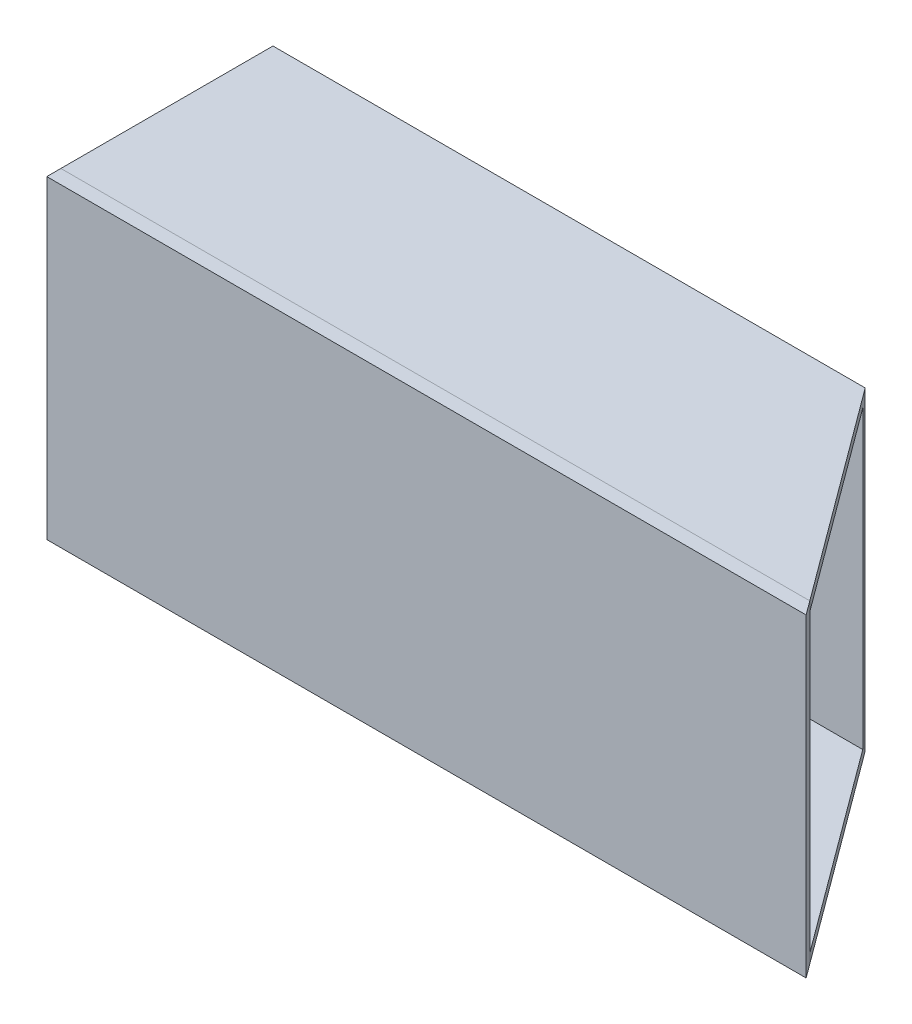
ISO-10303-21;
HEADER;
FILE_DESCRIPTION(('STEP AP214'),'2;1');
FILE_NAME('part.step','',(''),(''),'','','');
FILE_SCHEMA(('AUTOMOTIVE_DESIGN { 1 0 10303 214 1 1 1 1 }'));
ENDSEC;
DATA;
#1=APPLICATION_CONTEXT('core data for automotive mechanical design processes');
#2=APPLICATION_PROTOCOL_DEFINITION('international standard','automotive_design',2000,#1);
#3=PRODUCT_CONTEXT('',#1,'mechanical');
#4=PRODUCT('Part','Part','',(#3));
#5=PRODUCT_RELATED_PRODUCT_CATEGORY('part','',(#4));
#6=PRODUCT_DEFINITION_FORMATION('','',#4);
#7=PRODUCT_DEFINITION_CONTEXT('part definition',#1,'design');
#8=PRODUCT_DEFINITION('design','',#6,#7);
#9=PRODUCT_DEFINITION_SHAPE('','',#8);
#10=(LENGTH_UNIT() NAMED_UNIT(*) SI_UNIT(.MILLI.,.METRE.));
#11=(NAMED_UNIT(*) PLANE_ANGLE_UNIT() SI_UNIT($,.RADIAN.));
#12=(NAMED_UNIT(*) SI_UNIT($,.STERADIAN.) SOLID_ANGLE_UNIT());
#13=UNCERTAINTY_MEASURE_WITH_UNIT(LENGTH_MEASURE(1.E-05),#10,'distance_accuracy_value','');
#14=(GEOMETRIC_REPRESENTATION_CONTEXT(3) GLOBAL_UNCERTAINTY_ASSIGNED_CONTEXT((#13)) GLOBAL_UNIT_ASSIGNED_CONTEXT((#10,
#11,#12)) REPRESENTATION_CONTEXT('',''));
#15=CARTESIAN_POINT('',(0.,0.,0.));
#16=DIRECTION('',(0.,0.,1.));
#17=DIRECTION('',(1.,0.,0.));
#18=AXIS2_PLACEMENT_3D('',#15,#16,#17);
#19=CARTESIAN_POINT('',(0.,0.,0.));
#20=DIRECTION('',(0.,0.,-1.));
#21=DIRECTION('',(-1.,0.,0.));
#22=AXIS2_PLACEMENT_3D('',#19,#20,#21);
#23=PLANE('',#22);
#24=DIRECTION('',(0.,1.,0.));
#25=VECTOR('',#24,1.);
#26=CARTESIAN_POINT('',(89.335240673485,0.,0.));
#27=LINE('',#26,#25);
#28=CARTESIAN_POINT('',(89.3352406734849,-129.5,0.));
#29=VERTEX_POINT('',#28);
#30=CARTESIAN_POINT('',(89.3352406734849,-62.5,0.));
#31=VERTEX_POINT('',#30);
#32=EDGE_CURVE('E84',#29,#31,#27,.T.);
#33=ORIENTED_EDGE('',*,*,#32,.F.);
#34=DIRECTION('',(1.,0.,0.));
#35=VECTOR('',#34,1.);
#36=CARTESIAN_POINT('',(90.3908016052301,-129.5,0.));
#37=LINE('',#36,#35);
#38=CARTESIAN_POINT('',(-70.2750696839847,-129.5,0.));
#39=VERTEX_POINT('',#38);
#40=EDGE_CURVE('E87',#39,#29,#37,.T.);
#41=ORIENTED_EDGE('',*,*,#40,.F.);
#42=DIRECTION('',(0.,-1.,0.));
#43=VECTOR('',#42,1.);
#44=CARTESIAN_POINT('',(-70.2750696839847,-64.5,0.));
#45=LINE('',#44,#43);
#46=CARTESIAN_POINT('',(-70.2750696839846,-62.5,0.));
#47=VERTEX_POINT('',#46);
#48=EDGE_CURVE('E98',#47,#39,#45,.T.);
#49=ORIENTED_EDGE('',*,*,#48,.F.);
#50=DIRECTION('',(-1.,0.,0.));
#51=VECTOR('',#50,1.);
#52=CARTESIAN_POINT('',(90.3908016052301,-62.5,0.));
#53=LINE('',#52,#51);
#54=EDGE_CURVE('E89',#31,#47,#53,.T.);
#55=ORIENTED_EDGE('',*,*,#54,.F.);
#56=EDGE_LOOP('',(#33,#41,#49,#55));
#57=FACE_BOUND('',#56,.T.);
#58=ADVANCED_FACE('F42',(#57),#23,.T.);
#59=CARTESIAN_POINT('',(90.3908016052301,-129.5,-43.2));
#60=DIRECTION('',(0.,-1.,0.));
#61=DIRECTION('',(0.,0.,-1.));
#62=AXIS2_PLACEMENT_3D('',#59,#60,#61);
#63=PLANE('',#62);
#64=DIRECTION('',(0.,0.,1.));
#65=VECTOR('',#64,1.);
#66=CARTESIAN_POINT('',(-70.2750696839847,-129.5,-43.2));
#67=LINE('',#66,#65);
#68=CARTESIAN_POINT('',(-70.2750696839847,-129.5,3.));
#69=VERTEX_POINT('',#68);
#70=EDGE_CURVE('E91',#39,#69,#67,.T.);
#71=ORIENTED_EDGE('',*,*,#70,.F.);
#72=ORIENTED_EDGE('',*,*,#40,.T.);
#73=DIRECTION('',(-0.594194297617431,0.,-0.80432153811702));
#74=VECTOR('',#73,1.);
#75=CARTESIAN_POINT('',(69.0616389362199,-129.5,-27.443034370868));
#76=LINE('',#75,#74);
#77=CARTESIAN_POINT('',(91.5514972429975,-129.5,3.));
#78=VERTEX_POINT('',#77);
#79=EDGE_CURVE('E96',#78,#29,#76,.T.);
#80=ORIENTED_EDGE('',*,*,#79,.F.);
#81=DIRECTION('',(1.,0.,0.));
#82=VECTOR('',#81,1.);
#83=CARTESIAN_POINT('',(90.3908016052301,-129.5,3.));
#84=LINE('',#83,#82);
#85=EDGE_CURVE('E106',#69,#78,#84,.T.);
#86=ORIENTED_EDGE('',*,*,#85,.F.);
#87=EDGE_LOOP('',(#71,#72,#80,#86));
#88=FACE_BOUND('',#87,.T.);
#89=ADVANCED_FACE('F94',(#88),#63,.T.);
#90=CARTESIAN_POINT('',(0.,0.,3.));
#91=DIRECTION('',(0.,0.,-1.));
#92=DIRECTION('',(-1.,0.,0.));
#93=AXIS2_PLACEMENT_3D('',#90,#91,#92);
#94=PLANE('',#93);
#95=ORIENTED_EDGE('',*,*,#85,.T.);
#96=DIRECTION('',(0.,1.,0.));
#97=VECTOR('',#96,1.);
#98=CARTESIAN_POINT('',(91.5514972429975,-360.73705276397,3.));
#99=LINE('',#98,#97);
#100=CARTESIAN_POINT('',(91.5514972429975,-62.5,3.));
#101=VERTEX_POINT('',#100);
#102=EDGE_CURVE('E12',#78,#101,#99,.T.);
#103=ORIENTED_EDGE('',*,*,#102,.T.);
#104=DIRECTION('',(-1.,0.,0.));
#105=VECTOR('',#104,1.);
#106=CARTESIAN_POINT('',(90.3908016052301,-62.5,3.));
#107=LINE('',#106,#105);
#108=CARTESIAN_POINT('',(-70.2750696839847,-62.5,3.));
#109=VERTEX_POINT('',#108);
#110=EDGE_CURVE('E101',#101,#109,#107,.T.);
#111=ORIENTED_EDGE('',*,*,#110,.T.);
#112=DIRECTION('',(0.,-1.,0.));
#113=VECTOR('',#112,1.);
#114=CARTESIAN_POINT('',(-70.2750696839847,-64.5,3.));
#115=LINE('',#114,#113);
#116=EDGE_CURVE('E102',#109,#69,#115,.T.);
#117=ORIENTED_EDGE('',*,*,#116,.T.);
#118=EDGE_LOOP('',(#95,#103,#111,#117));
#119=FACE_BOUND('',#118,.T.);
#120=ADVANCED_FACE('F114',(#119),#94,.F.);
#121=CARTESIAN_POINT('',(-70.2750696839847,-64.5,-43.2));
#122=DIRECTION('',(-1.,0.,0.));
#123=DIRECTION('',(0.,0.,1.));
#124=AXIS2_PLACEMENT_3D('',#121,#122,#123);
#125=PLANE('',#124);
#126=DIRECTION('',(0.,0.,1.));
#127=VECTOR('',#126,1.);
#128=CARTESIAN_POINT('',(-70.2750696839846,-62.5,-43.2));
#129=LINE('',#128,#127);
#130=EDGE_CURVE('E65',#47,#109,#129,.T.);
#131=ORIENTED_EDGE('',*,*,#130,.F.);
#132=ORIENTED_EDGE('',*,*,#48,.T.);
#133=ORIENTED_EDGE('',*,*,#70,.T.);
#134=ORIENTED_EDGE('',*,*,#116,.F.);
#135=EDGE_LOOP('',(#131,#132,#133,#134));
#136=FACE_BOUND('',#135,.T.);
#137=ADVANCED_FACE('F116',(#136),#125,.T.);
#138=CARTESIAN_POINT('',(55.943641692829,-360.73705276397,-45.2));
#139=DIRECTION('',(-0.804321538117019,0.,0.594194297617431));
#140=DIRECTION('',(0.594194297617431,0.,0.80432153811702));
#141=AXIS2_PLACEMENT_3D('',#138,#139,#140);
#142=PLANE('',#141);
#143=ORIENTED_EDGE('',*,*,#32,.T.);
#144=DIRECTION('',(0.594194297617431,0.,0.80432153811702));
#145=VECTOR('',#144,1.);
#146=CARTESIAN_POINT('',(69.0616389362199,-62.5,-27.443034370868));
#147=LINE('',#146,#145);
#148=EDGE_CURVE('E46',#31,#101,#147,.T.);
#149=ORIENTED_EDGE('',*,*,#148,.T.);
#150=ORIENTED_EDGE('',*,*,#102,.F.);
#151=ORIENTED_EDGE('',*,*,#79,.T.);
#152=EDGE_LOOP('',(#143,#149,#150,#151));
#153=FACE_BOUND('',#152,.T.);
#154=ADVANCED_FACE('F100',(#153),#142,.F.);
#155=CARTESIAN_POINT('',(90.3908016052301,-62.5,-43.2));
#156=DIRECTION('',(0.,1.,0.));
#157=DIRECTION('',(0.,0.,1.));
#158=AXIS2_PLACEMENT_3D('',#155,#156,#157);
#159=PLANE('',#158);
#160=ORIENTED_EDGE('',*,*,#148,.F.);
#161=ORIENTED_EDGE('',*,*,#54,.T.);
#162=ORIENTED_EDGE('',*,*,#130,.T.);
#163=ORIENTED_EDGE('',*,*,#110,.F.);
#164=EDGE_LOOP('',(#160,#161,#162,#163));
#165=FACE_BOUND('',#164,.T.);
#166=ADVANCED_FACE('F44',(#165),#159,.T.);
#167=CLOSED_SHELL('',(#58,#89,#120,#137,#154,#166));
#168=MANIFOLD_SOLID_BREP('B2',#167);
#169=CARTESIAN_POINT('',(0.,0.,0.));
#170=DIRECTION('',(0.,0.,-1.));
#171=DIRECTION('',(-1.,0.,0.));
#172=AXIS2_PLACEMENT_3D('',#169,#170,#171);
#173=PLANE('',#172);
#174=DIRECTION('',(0.,-1.,0.));
#175=VECTOR('',#174,1.);
#176=CARTESIAN_POINT('',(89.3352406734849,-360.73705276397,0.));
#177=LINE('',#176,#175);
#178=CARTESIAN_POINT('',(89.3352406734849,-62.5,0.));
#179=VERTEX_POINT('',#178);
#180=CARTESIAN_POINT('',(89.335240673485,-64.5,0.));
#181=VERTEX_POINT('',#180);
#182=EDGE_CURVE('E171',#179,#181,#177,.T.);
#183=ORIENTED_EDGE('',*,*,#182,.F.);
#184=DIRECTION('',(-1.,0.,0.));
#185=VECTOR('',#184,1.);
#186=CARTESIAN_POINT('',(90.3908016052301,-62.5,0.));
#187=LINE('',#186,#185);
#188=CARTESIAN_POINT('',(-70.2750696839846,-62.5,0.));
#189=VERTEX_POINT('',#188);
#190=EDGE_CURVE('E40',#179,#189,#187,.T.);
#191=ORIENTED_EDGE('',*,*,#190,.T.);
#192=DIRECTION('',(0.,-1.,0.));
#193=VECTOR('',#192,1.);
#194=CARTESIAN_POINT('',(-70.2750696839847,-64.5,0.));
#195=LINE('',#194,#193);
#196=CARTESIAN_POINT('',(-70.2750696839847,-129.5,0.));
#197=VERTEX_POINT('',#196);
#198=EDGE_CURVE('E176',#189,#197,#195,.T.);
#199=ORIENTED_EDGE('',*,*,#198,.T.);
#200=DIRECTION('',(1.,0.,0.));
#201=VECTOR('',#200,1.);
#202=CARTESIAN_POINT('',(90.3908016052301,-129.5,0.));
#203=LINE('',#202,#201);
#204=CARTESIAN_POINT('',(89.3352406734849,-129.5,0.));
#205=VERTEX_POINT('',#204);
#206=EDGE_CURVE('E294',#197,#205,#203,.T.);
#207=ORIENTED_EDGE('',*,*,#206,.T.);
#208=CARTESIAN_POINT('',(89.335240673485,-127.5,0.));
#209=VERTEX_POINT('',#208);
#210=EDGE_CURVE('E240',#209,#205,#177,.T.);
#211=ORIENTED_EDGE('',*,*,#210,.F.);
#212=DIRECTION('',(1.,0.,0.));
#213=VECTOR('',#212,1.);
#214=CARTESIAN_POINT('',(90.3908016052301,-127.5,0.));
#215=LINE('',#214,#213);
#216=CARTESIAN_POINT('',(-67.2750696839847,-127.5,0.));
#217=VERTEX_POINT('',#216);
#218=EDGE_CURVE('E278',#217,#209,#215,.T.);
#219=ORIENTED_EDGE('',*,*,#218,.F.);
#220=DIRECTION('',(0.,-1.,0.));
#221=VECTOR('',#220,1.);
#222=CARTESIAN_POINT('',(-67.2750696839847,-64.5,0.));
#223=LINE('',#222,#221);
#224=CARTESIAN_POINT('',(-67.2750696839847,-64.5,0.));
#225=VERTEX_POINT('',#224);
#226=EDGE_CURVE('E274',#225,#217,#223,.T.);
#227=ORIENTED_EDGE('',*,*,#226,.F.);
#228=DIRECTION('',(-1.,0.,0.));
#229=VECTOR('',#228,1.);
#230=CARTESIAN_POINT('',(90.3908016052301,-64.5,0.));
#231=LINE('',#230,#229);
#232=EDGE_CURVE('E276',#181,#225,#231,.T.);
#233=ORIENTED_EDGE('',*,*,#232,.F.);
#234=EDGE_LOOP('',(#183,#191,#199,#207,#211,#219,#227,#233));
#235=FACE_BOUND('',#234,.T.);
#236=ADVANCED_FACE('F168',(#235),#173,.F.);
#237=CARTESIAN_POINT('',(-67.2750696839847,-64.5,-43.2));
#238=DIRECTION('',(-1.,0.,0.));
#239=DIRECTION('',(0.,0.,1.));
#240=AXIS2_PLACEMENT_3D('',#237,#238,#239);
#241=PLANE('',#240);
#242=ORIENTED_EDGE('',*,*,#226,.T.);
#243=DIRECTION('',(0.,0.,1.));
#244=VECTOR('',#243,1.);
#245=CARTESIAN_POINT('',(-67.2750696839847,-127.5,-43.2));
#246=LINE('',#245,#244);
#247=CARTESIAN_POINT('',(-67.2750696839847,-127.5,-43.2));
#248=VERTEX_POINT('',#247);
#249=EDGE_CURVE('E285',#248,#217,#246,.T.);
#250=ORIENTED_EDGE('',*,*,#249,.F.);
#251=DIRECTION('',(0.,-1.,0.));
#252=VECTOR('',#251,1.);
#253=CARTESIAN_POINT('',(-67.2750696839847,-64.5,-43.2));
#254=LINE('',#253,#252);
#255=CARTESIAN_POINT('',(-67.2750696839847,-64.5,-43.2));
#256=VERTEX_POINT('',#255);
#257=EDGE_CURVE('E288',#256,#248,#254,.T.);
#258=ORIENTED_EDGE('',*,*,#257,.F.);
#259=DIRECTION('',(0.,0.,1.));
#260=VECTOR('',#259,1.);
#261=CARTESIAN_POINT('',(-67.2750696839847,-64.5,-43.2));
#262=LINE('',#261,#260);
#263=EDGE_CURVE('E280',#256,#225,#262,.T.);
#264=ORIENTED_EDGE('',*,*,#263,.T.);
#265=EDGE_LOOP('',(#242,#250,#258,#264));
#266=FACE_BOUND('',#265,.T.);
#267=ADVANCED_FACE('F310',(#266),#241,.F.);
#268=CARTESIAN_POINT('',(90.3908016052301,-127.5,-43.2));
#269=DIRECTION('',(0.,-1.,0.));
#270=DIRECTION('',(0.,0.,-1.));
#271=AXIS2_PLACEMENT_3D('',#268,#269,#270);
#272=PLANE('',#271);
#273=DIRECTION('',(-0.594194297617431,0.,-0.804321538117019));
#274=VECTOR('',#273,1.);
#275=CARTESIAN_POINT('',(51.2571512718471,-127.5,-51.5437922559832));
#276=LINE('',#275,#274);
#277=CARTESIAN_POINT('',(57.4211460725041,-127.5,-43.2));
#278=VERTEX_POINT('',#277);
#279=EDGE_CURVE('E265',#209,#278,#276,.T.);
#280=ORIENTED_EDGE('',*,*,#279,.T.);
#281=DIRECTION('',(1.,0.,0.));
#282=VECTOR('',#281,1.);
#283=CARTESIAN_POINT('',(90.3908016052301,-127.5,-43.2));
#284=LINE('',#283,#282);
#285=EDGE_CURVE('E291',#248,#278,#284,.T.);
#286=ORIENTED_EDGE('',*,*,#285,.F.);
#287=ORIENTED_EDGE('',*,*,#249,.T.);
#288=ORIENTED_EDGE('',*,*,#218,.T.);
#289=EDGE_LOOP('',(#280,#286,#287,#288));
#290=FACE_BOUND('',#289,.T.);
#291=ADVANCED_FACE('F307',(#290),#272,.F.);
#292=CARTESIAN_POINT('',(0.,0.,-43.2));
#293=DIRECTION('',(0.,0.,-1.));
#294=DIRECTION('',(-1.,0.,0.));
#295=AXIS2_PLACEMENT_3D('',#292,#293,#294);
#296=PLANE('',#295);
#297=DIRECTION('',(0.,1.,0.));
#298=VECTOR('',#297,1.);
#299=CARTESIAN_POINT('',(57.4211460725041,0.,-43.2));
#300=LINE('',#299,#298);
#301=CARTESIAN_POINT('',(57.4211460725041,-64.5,-43.2));
#302=VERTEX_POINT('',#301);
#303=EDGE_CURVE('E271',#278,#302,#300,.T.);
#304=ORIENTED_EDGE('',*,*,#303,.T.);
#305=DIRECTION('',(-1.,0.,0.));
#306=VECTOR('',#305,1.);
#307=CARTESIAN_POINT('',(90.3908016052301,-64.5,-43.2));
#308=LINE('',#307,#306);
#309=EDGE_CURVE('E283',#302,#256,#308,.T.);
#310=ORIENTED_EDGE('',*,*,#309,.T.);
#311=ORIENTED_EDGE('',*,*,#257,.T.);
#312=ORIENTED_EDGE('',*,*,#285,.T.);
#313=EDGE_LOOP('',(#304,#310,#311,#312));
#314=FACE_BOUND('',#313,.T.);
#315=ADVANCED_FACE('F304',(#314),#296,.F.);
#316=CARTESIAN_POINT('',(90.3908016052301,-64.5,-43.2));
#317=DIRECTION('',(0.,1.,0.));
#318=DIRECTION('',(0.,0.,1.));
#319=AXIS2_PLACEMENT_3D('',#316,#317,#318);
#320=PLANE('',#319);
#321=DIRECTION('',(0.594194297617431,0.,0.80432153811702));
#322=VECTOR('',#321,1.);
#323=CARTESIAN_POINT('',(69.0616389362199,-64.5,-27.443034370868));
#324=LINE('',#323,#322);
#325=EDGE_CURVE('E268',#302,#181,#324,.T.);
#326=ORIENTED_EDGE('',*,*,#325,.T.);
#327=ORIENTED_EDGE('',*,*,#232,.T.);
#328=ORIENTED_EDGE('',*,*,#263,.F.);
#329=ORIENTED_EDGE('',*,*,#309,.F.);
#330=EDGE_LOOP('',(#326,#327,#328,#329));
#331=FACE_BOUND('',#330,.T.);
#332=ADVANCED_FACE('F299',(#331),#320,.F.);
#333=CARTESIAN_POINT('',(90.3908016052301,-129.5,-43.2));
#334=DIRECTION('',(0.,-1.,0.));
#335=DIRECTION('',(0.,0.,-1.));
#336=AXIS2_PLACEMENT_3D('',#333,#334,#335);
#337=PLANE('',#336);
#338=ORIENTED_EDGE('',*,*,#206,.F.);
#339=DIRECTION('',(0.,0.,1.));
#340=VECTOR('',#339,1.);
#341=CARTESIAN_POINT('',(-70.2750696839847,-129.5,-43.2));
#342=LINE('',#341,#340);
#343=CARTESIAN_POINT('',(-70.2750696839847,-129.5,-45.2));
#344=VERTEX_POINT('',#343);
#345=EDGE_CURVE('E255',#344,#197,#342,.T.);
#346=ORIENTED_EDGE('',*,*,#345,.F.);
#347=DIRECTION('',(1.,0.,0.));
#348=VECTOR('',#347,1.);
#349=CARTESIAN_POINT('',(90.3908016052301,-129.5,-45.2));
#350=LINE('',#349,#348);
#351=CARTESIAN_POINT('',(55.943641692829,-129.5,-45.2));
#352=VERTEX_POINT('',#351);
#353=EDGE_CURVE('E252',#344,#352,#350,.T.);
#354=ORIENTED_EDGE('',*,*,#353,.T.);
#355=DIRECTION('',(-0.594194297617431,0.,-0.80432153811702));
#356=VECTOR('',#355,1.);
#357=CARTESIAN_POINT('',(69.0616389362199,-129.5,-27.443034370868));
#358=LINE('',#357,#356);
#359=EDGE_CURVE('E233',#205,#352,#358,.T.);
#360=ORIENTED_EDGE('',*,*,#359,.F.);
#361=EDGE_LOOP('',(#338,#346,#354,#360));
#362=FACE_BOUND('',#361,.T.);
#363=ADVANCED_FACE('F254',(#362),#337,.T.);
#364=CARTESIAN_POINT('',(-70.2750696839847,-64.5,-43.2));
#365=DIRECTION('',(-1.,0.,0.));
#366=DIRECTION('',(0.,0.,1.));
#367=AXIS2_PLACEMENT_3D('',#364,#365,#366);
#368=PLANE('',#367);
#369=ORIENTED_EDGE('',*,*,#198,.F.);
#370=DIRECTION('',(0.,0.,1.));
#371=VECTOR('',#370,1.);
#372=CARTESIAN_POINT('',(-70.2750696839846,-62.5,-43.2));
#373=LINE('',#372,#371);
#374=CARTESIAN_POINT('',(-70.2750696839847,-62.5,-45.2));
#375=VERTEX_POINT('',#374);
#376=EDGE_CURVE('E257',#375,#189,#373,.T.);
#377=ORIENTED_EDGE('',*,*,#376,.F.);
#378=DIRECTION('',(0.,-1.,0.));
#379=VECTOR('',#378,1.);
#380=CARTESIAN_POINT('',(-70.2750696839847,-64.5,-45.2));
#381=LINE('',#380,#379);
#382=EDGE_CURVE('E258',#375,#344,#381,.T.);
#383=ORIENTED_EDGE('',*,*,#382,.T.);
#384=ORIENTED_EDGE('',*,*,#345,.T.);
#385=EDGE_LOOP('',(#369,#377,#383,#384));
#386=FACE_BOUND('',#385,.T.);
#387=ADVANCED_FACE('F327',(#386),#368,.T.);
#388=CARTESIAN_POINT('',(0.,0.,-45.2));
#389=DIRECTION('',(0.,0.,-1.));
#390=DIRECTION('',(-1.,0.,0.));
#391=AXIS2_PLACEMENT_3D('',#388,#389,#390);
#392=PLANE('',#391);
#393=DIRECTION('',(0.,1.,0.));
#394=VECTOR('',#393,1.);
#395=CARTESIAN_POINT('',(55.943641692829,-360.73705276397,-45.2));
#396=LINE('',#395,#394);
#397=CARTESIAN_POINT('',(55.943641692829,-62.5,-45.2));
#398=VERTEX_POINT('',#397);
#399=EDGE_CURVE('E237',#352,#398,#396,.T.);
#400=ORIENTED_EDGE('',*,*,#399,.F.);
#401=ORIENTED_EDGE('',*,*,#353,.F.);
#402=ORIENTED_EDGE('',*,*,#382,.F.);
#403=DIRECTION('',(-1.,0.,0.));
#404=VECTOR('',#403,1.);
#405=CARTESIAN_POINT('',(90.3908016052301,-62.5,-45.2));
#406=LINE('',#405,#404);
#407=EDGE_CURVE('E244',#398,#375,#406,.T.);
#408=ORIENTED_EDGE('',*,*,#407,.F.);
#409=EDGE_LOOP('',(#400,#401,#402,#408));
#410=FACE_BOUND('',#409,.T.);
#411=ADVANCED_FACE('F250',(#410),#392,.T.);
#412=CARTESIAN_POINT('',(55.943641692829,-360.73705276397,-45.2));
#413=DIRECTION('',(-0.804321538117019,0.,0.594194297617431));
#414=DIRECTION('',(0.594194297617431,0.,0.80432153811702));
#415=AXIS2_PLACEMENT_3D('',#412,#413,#414);
#416=PLANE('',#415);
#417=DIRECTION('',(0.594194297617431,0.,0.80432153811702));
#418=VECTOR('',#417,1.);
#419=CARTESIAN_POINT('',(69.0616389362199,-62.5,-27.443034370868));
#420=LINE('',#419,#418);
#421=EDGE_CURVE('E245',#398,#179,#420,.T.);
#422=ORIENTED_EDGE('',*,*,#421,.T.);
#423=ORIENTED_EDGE('',*,*,#182,.T.);
#424=ORIENTED_EDGE('',*,*,#325,.F.);
#425=ORIENTED_EDGE('',*,*,#303,.F.);
#426=ORIENTED_EDGE('',*,*,#279,.F.);
#427=ORIENTED_EDGE('',*,*,#210,.T.);
#428=ORIENTED_EDGE('',*,*,#359,.T.);
#429=ORIENTED_EDGE('',*,*,#399,.T.);
#430=EDGE_LOOP('',(#422,#423,#424,#425,#426,#427,#428,#429));
#431=FACE_BOUND('',#430,.T.);
#432=ADVANCED_FACE('F236',(#431),#416,.F.);
#433=CARTESIAN_POINT('',(90.3908016052301,-62.5,-43.2));
#434=DIRECTION('',(0.,1.,0.));
#435=DIRECTION('',(0.,0.,1.));
#436=AXIS2_PLACEMENT_3D('',#433,#434,#435);
#437=PLANE('',#436);
#438=ORIENTED_EDGE('',*,*,#190,.F.);
#439=ORIENTED_EDGE('',*,*,#421,.F.);
#440=ORIENTED_EDGE('',*,*,#407,.T.);
#441=ORIENTED_EDGE('',*,*,#376,.T.);
#442=EDGE_LOOP('',(#438,#439,#440,#441));
#443=FACE_BOUND('',#442,.T.);
#444=ADVANCED_FACE('F311',(#443),#437,.T.);
#445=CLOSED_SHELL('',(#236,#267,#291,#315,#332,#363,#387,#411,#432,#444));
#446=MANIFOLD_SOLID_BREP('B6',#445);
#447=ADVANCED_BREP_SHAPE_REPRESENTATION('',(#18,#168,#446),#14);
#448=SHAPE_DEFINITION_REPRESENTATION(#9,#447);
ENDSEC;
END-ISO-10303-21;
